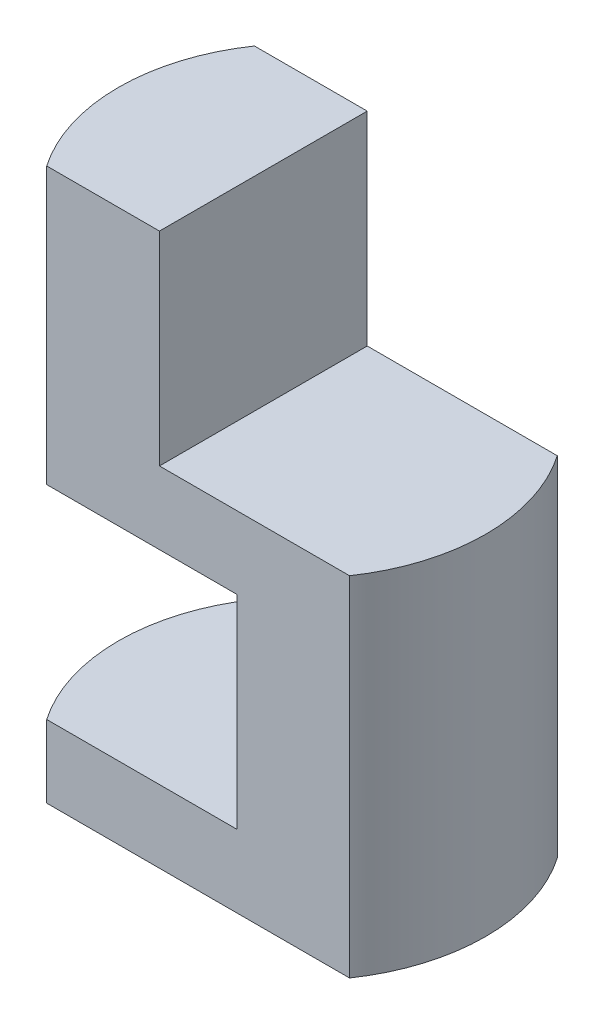
ISO-10303-21;
HEADER;
FILE_DESCRIPTION(('STEP AP214'),'2;1');
FILE_NAME('part.step','',(''),(''),'','','');
FILE_SCHEMA(('AUTOMOTIVE_DESIGN { 1 0 10303 214 1 1 1 1 }'));
ENDSEC;
DATA;
#1=APPLICATION_CONTEXT('core data for automotive mechanical design processes');
#2=APPLICATION_PROTOCOL_DEFINITION('international standard','automotive_design',2000,#1);
#3=PRODUCT_CONTEXT('',#1,'mechanical');
#4=PRODUCT('Part','Part','',(#3));
#5=PRODUCT_RELATED_PRODUCT_CATEGORY('part','',(#4));
#6=PRODUCT_DEFINITION_FORMATION('','',#4);
#7=PRODUCT_DEFINITION_CONTEXT('part definition',#1,'design');
#8=PRODUCT_DEFINITION('design','',#6,#7);
#9=PRODUCT_DEFINITION_SHAPE('','',#8);
#10=(LENGTH_UNIT() NAMED_UNIT(*) SI_UNIT(.MILLI.,.METRE.));
#11=(NAMED_UNIT(*) PLANE_ANGLE_UNIT() SI_UNIT($,.RADIAN.));
#12=(NAMED_UNIT(*) SI_UNIT($,.STERADIAN.) SOLID_ANGLE_UNIT());
#13=UNCERTAINTY_MEASURE_WITH_UNIT(LENGTH_MEASURE(1.E-05),#10,'distance_accuracy_value','');
#14=(GEOMETRIC_REPRESENTATION_CONTEXT(3) GLOBAL_UNCERTAINTY_ASSIGNED_CONTEXT((#13)) GLOBAL_UNIT_ASSIGNED_CONTEXT((#10,
#11,#12)) REPRESENTATION_CONTEXT('',''));
#15=CARTESIAN_POINT('',(0.,0.,0.));
#16=DIRECTION('',(0.,0.,1.));
#17=DIRECTION('',(1.,0.,0.));
#18=AXIS2_PLACEMENT_3D('',#15,#16,#17);
#19=CARTESIAN_POINT('',(0.,15.,0.));
#20=DIRECTION('',(0.,1.,0.));
#21=DIRECTION('',(0.,0.,1.));
#22=AXIS2_PLACEMENT_3D('',#19,#20,#21);
#23=PLANE('',#22);
#24=CARTESIAN_POINT('',(0.,15.,0.));
#25=DIRECTION('',(0.,1.,0.));
#26=DIRECTION('',(0.,0.,1.));
#27=AXIS2_PLACEMENT_3D('',#24,#25,#26);
#28=CIRCLE('',#27,38.);
#29=CARTESIAN_POINT('',(-31.3328900677866,15.,21.5));
#30=VERTEX_POINT('',#29);
#31=CARTESIAN_POINT('',(-31.3328900677866,15.,-21.5));
#32=VERTEX_POINT('',#31);
#33=EDGE_CURVE('E216',#30,#32,#28,.F.);
#34=ORIENTED_EDGE('',*,*,#33,.F.);
#35=DIRECTION('',(1.,0.,0.));
#36=VECTOR('',#35,1.);
#37=CARTESIAN_POINT('',(-38.,15.,21.5));
#38=LINE('',#37,#36);
#39=CARTESIAN_POINT('',(8.00000000000001,15.,21.5));
#40=VERTEX_POINT('',#39);
#41=EDGE_CURVE('E192',#30,#40,#38,.T.);
#42=ORIENTED_EDGE('',*,*,#41,.T.);
#43=DIRECTION('',(0.,0.,1.));
#44=VECTOR('',#43,1.);
#45=CARTESIAN_POINT('',(8.00000000000001,15.,21.5));
#46=LINE('',#45,#44);
#47=CARTESIAN_POINT('',(8.00000000000001,15.,-21.5));
#48=VERTEX_POINT('',#47);
#49=EDGE_CURVE('E177',#48,#40,#46,.T.);
#50=ORIENTED_EDGE('',*,*,#49,.F.);
#51=DIRECTION('',(1.,0.,0.));
#52=VECTOR('',#51,1.);
#53=CARTESIAN_POINT('',(-38.,15.,-21.5));
#54=LINE('',#53,#52);
#55=EDGE_CURVE('E65',#32,#48,#54,.T.);
#56=ORIENTED_EDGE('',*,*,#55,.F.);
#57=EDGE_LOOP('',(#34,#42,#50,#56));
#58=FACE_BOUND('',#57,.T.);
#59=ADVANCED_FACE('F57',(#58),#23,.T.);
#60=CARTESIAN_POINT('',(0.,0.,0.));
#61=DIRECTION('',(0.,1.,0.));
#62=DIRECTION('',(0.,0.,1.));
#63=AXIS2_PLACEMENT_3D('',#60,#61,#62);
#64=PLANE('',#63);
#65=DIRECTION('',(1.,0.,0.));
#66=VECTOR('',#65,1.);
#67=CARTESIAN_POINT('',(-38.,0.,21.5));
#68=LINE('',#67,#66);
#69=CARTESIAN_POINT('',(-31.3328900677866,0.,21.5));
#70=VERTEX_POINT('',#69);
#71=CARTESIAN_POINT('',(31.3328900677866,0.,21.5));
#72=VERTEX_POINT('',#71);
#73=EDGE_CURVE('E191',#70,#72,#68,.T.);
#74=ORIENTED_EDGE('',*,*,#73,.F.);
#75=CARTESIAN_POINT('',(0.,0.,0.));
#76=DIRECTION('',(0.,1.,0.));
#77=DIRECTION('',(0.,0.,1.));
#78=AXIS2_PLACEMENT_3D('',#75,#76,#77);
#79=CIRCLE('',#78,38.);
#80=CARTESIAN_POINT('',(-31.3328900677866,0.,-21.5));
#81=VERTEX_POINT('',#80);
#82=EDGE_CURVE('E72',#81,#70,#79,.T.);
#83=ORIENTED_EDGE('',*,*,#82,.F.);
#84=DIRECTION('',(1.,0.,0.));
#85=VECTOR('',#84,1.);
#86=CARTESIAN_POINT('',(-38.,0.,-21.5));
#87=LINE('',#86,#85);
#88=CARTESIAN_POINT('',(31.3328900677866,0.,-21.5));
#89=VERTEX_POINT('',#88);
#90=EDGE_CURVE('E194',#81,#89,#87,.T.);
#91=ORIENTED_EDGE('',*,*,#90,.T.);
#92=EDGE_CURVE('E200',#72,#89,#79,.T.);
#93=ORIENTED_EDGE('',*,*,#92,.F.);
#94=EDGE_LOOP('',(#74,#83,#91,#93));
#95=FACE_BOUND('',#94,.T.);
#96=ADVANCED_FACE('F199',(#95),#64,.F.);
#97=CARTESIAN_POINT('',(0.,57.1,0.));
#98=DIRECTION('',(0.,1.,0.));
#99=DIRECTION('',(0.,0.,1.));
#100=AXIS2_PLACEMENT_3D('',#97,#98,#99);
#101=PLANE('',#100);
#102=DIRECTION('',(1.,0.,0.));
#103=VECTOR('',#102,1.);
#104=CARTESIAN_POINT('',(0.,57.1,21.5));
#105=LINE('',#104,#103);
#106=CARTESIAN_POINT('',(-31.3328900677866,57.1,21.5));
#107=VERTEX_POINT('',#106);
#108=CARTESIAN_POINT('',(8.00000000000001,57.1,21.5));
#109=VERTEX_POINT('',#108);
#110=EDGE_CURVE('E172',#107,#109,#105,.T.);
#111=ORIENTED_EDGE('',*,*,#110,.F.);
#112=CARTESIAN_POINT('',(0.,57.1,0.));
#113=DIRECTION('',(0.,1.,0.));
#114=DIRECTION('',(0.,0.,1.));
#115=AXIS2_PLACEMENT_3D('',#112,#113,#114);
#116=CIRCLE('',#115,38.);
#117=CARTESIAN_POINT('',(-31.3328900677866,57.1,-21.5));
#118=VERTEX_POINT('',#117);
#119=EDGE_CURVE('E152',#107,#118,#116,.F.);
#120=ORIENTED_EDGE('',*,*,#119,.T.);
#121=DIRECTION('',(-1.,0.,0.));
#122=VECTOR('',#121,1.);
#123=CARTESIAN_POINT('',(0.,57.1,-21.5));
#124=LINE('',#123,#122);
#125=CARTESIAN_POINT('',(8.00000000000001,57.1,-21.5));
#126=VERTEX_POINT('',#125);
#127=EDGE_CURVE('E151',#126,#118,#124,.T.);
#128=ORIENTED_EDGE('',*,*,#127,.F.);
#129=DIRECTION('',(0.,0.,1.));
#130=VECTOR('',#129,1.);
#131=CARTESIAN_POINT('',(8.00000000000001,57.1,21.5));
#132=LINE('',#131,#130);
#133=EDGE_CURVE('E180',#126,#109,#132,.T.);
#134=ORIENTED_EDGE('',*,*,#133,.T.);
#135=EDGE_LOOP('',(#111,#120,#128,#134));
#136=FACE_BOUND('',#135,.T.);
#137=ADVANCED_FACE('F241',(#136),#101,.F.);
#138=CARTESIAN_POINT('',(0.,72.1,0.));
#139=DIRECTION('',(0.,1.,0.));
#140=DIRECTION('',(0.,0.,1.));
#141=AXIS2_PLACEMENT_3D('',#138,#139,#140);
#142=PLANE('',#141);
#143=CARTESIAN_POINT('',(0.,72.1,0.));
#144=DIRECTION('',(0.,1.,0.));
#145=DIRECTION('',(0.,0.,1.));
#146=AXIS2_PLACEMENT_3D('',#143,#144,#145);
#147=CIRCLE('',#146,38.);
#148=CARTESIAN_POINT('',(31.3328900677866,72.1,-21.5));
#149=VERTEX_POINT('',#148);
#150=CARTESIAN_POINT('',(31.3328900677866,72.1,21.5));
#151=VERTEX_POINT('',#150);
#152=EDGE_CURVE('E207',#149,#151,#147,.F.);
#153=ORIENTED_EDGE('',*,*,#152,.F.);
#154=DIRECTION('',(-1.,0.,0.));
#155=VECTOR('',#154,1.);
#156=CARTESIAN_POINT('',(0.,72.1,-21.5));
#157=LINE('',#156,#155);
#158=CARTESIAN_POINT('',(-7.99999999999999,72.1,-21.5));
#159=VERTEX_POINT('',#158);
#160=EDGE_CURVE('E175',#149,#159,#157,.T.);
#161=ORIENTED_EDGE('',*,*,#160,.T.);
#162=DIRECTION('',(0.,0.,-1.));
#163=VECTOR('',#162,1.);
#164=CARTESIAN_POINT('',(-7.99999999999999,72.1,-21.5));
#165=LINE('',#164,#163);
#166=CARTESIAN_POINT('',(-7.99999999999999,72.1,21.5));
#167=VERTEX_POINT('',#166);
#168=EDGE_CURVE('E80',#167,#159,#165,.T.);
#169=ORIENTED_EDGE('',*,*,#168,.F.);
#170=DIRECTION('',(1.,0.,0.));
#171=VECTOR('',#170,1.);
#172=CARTESIAN_POINT('',(0.,72.1,21.5));
#173=LINE('',#172,#171);
#174=EDGE_CURVE('E173',#167,#151,#173,.T.);
#175=ORIENTED_EDGE('',*,*,#174,.T.);
#176=EDGE_LOOP('',(#153,#161,#169,#175));
#177=FACE_BOUND('',#176,.T.);
#178=ADVANCED_FACE('F252',(#177),#142,.T.);
#179=CARTESIAN_POINT('',(0.,114.2,0.));
#180=DIRECTION('',(0.,1.,0.));
#181=DIRECTION('',(0.,0.,1.));
#182=AXIS2_PLACEMENT_3D('',#179,#180,#181);
#183=PLANE('',#182);
#184=CARTESIAN_POINT('',(0.,114.2,0.));
#185=DIRECTION('',(0.,1.,0.));
#186=DIRECTION('',(0.,0.,1.));
#187=AXIS2_PLACEMENT_3D('',#184,#185,#186);
#188=CIRCLE('',#187,38.);
#189=CARTESIAN_POINT('',(-31.3328900677866,114.2,21.5));
#190=VERTEX_POINT('',#189);
#191=CARTESIAN_POINT('',(-31.3328900677866,114.2,-21.5));
#192=VERTEX_POINT('',#191);
#193=EDGE_CURVE('E13',#190,#192,#188,.F.);
#194=ORIENTED_EDGE('',*,*,#193,.F.);
#195=DIRECTION('',(1.,0.,0.));
#196=VECTOR('',#195,1.);
#197=CARTESIAN_POINT('',(-38.,114.2,21.5));
#198=LINE('',#197,#196);
#199=CARTESIAN_POINT('',(-7.99999999999999,114.2,21.5));
#200=VERTEX_POINT('',#199);
#201=EDGE_CURVE('E164',#190,#200,#198,.T.);
#202=ORIENTED_EDGE('',*,*,#201,.T.);
#203=DIRECTION('',(0.,0.,-1.));
#204=VECTOR('',#203,1.);
#205=CARTESIAN_POINT('',(-7.99999999999999,114.2,-21.5));
#206=LINE('',#205,#204);
#207=CARTESIAN_POINT('',(-7.99999999999999,114.2,-21.5));
#208=VERTEX_POINT('',#207);
#209=EDGE_CURVE('E158',#200,#208,#206,.T.);
#210=ORIENTED_EDGE('',*,*,#209,.T.);
#211=DIRECTION('',(-1.,0.,0.));
#212=VECTOR('',#211,1.);
#213=CARTESIAN_POINT('',(-38.,114.2,-21.5));
#214=LINE('',#213,#212);
#215=EDGE_CURVE('E149',#208,#192,#214,.T.);
#216=ORIENTED_EDGE('',*,*,#215,.T.);
#217=EDGE_LOOP('',(#194,#202,#210,#216));
#218=FACE_BOUND('',#217,.T.);
#219=ADVANCED_FACE('F156',(#218),#183,.T.);
#220=CARTESIAN_POINT('',(-38.,15.,21.5));
#221=DIRECTION('',(0.,0.,-1.));
#222=DIRECTION('',(-1.,0.,0.));
#223=AXIS2_PLACEMENT_3D('',#220,#221,#222);
#224=PLANE('',#223);
#225=ORIENTED_EDGE('',*,*,#73,.T.);
#226=DIRECTION('',(0.,-1.,0.));
#227=VECTOR('',#226,1.);
#228=CARTESIAN_POINT('',(31.3328900677866,114.2,21.5));
#229=LINE('',#228,#227);
#230=EDGE_CURVE('E153',#72,#151,#229,.F.);
#231=ORIENTED_EDGE('',*,*,#230,.T.);
#232=ORIENTED_EDGE('',*,*,#174,.F.);
#233=DIRECTION('',(0.,-1.,0.));
#234=VECTOR('',#233,1.);
#235=CARTESIAN_POINT('',(-7.99999999999999,114.2,21.5));
#236=LINE('',#235,#234);
#237=EDGE_CURVE('E162',#200,#167,#236,.T.);
#238=ORIENTED_EDGE('',*,*,#237,.F.);
#239=ORIENTED_EDGE('',*,*,#201,.F.);
#240=DIRECTION('',(0.,-1.,0.));
#241=VECTOR('',#240,1.);
#242=CARTESIAN_POINT('',(-31.3328900677866,114.2,21.5));
#243=LINE('',#242,#241);
#244=EDGE_CURVE('E140',#190,#107,#243,.T.);
#245=ORIENTED_EDGE('',*,*,#244,.T.);
#246=ORIENTED_EDGE('',*,*,#110,.T.);
#247=DIRECTION('',(0.,-1.,0.));
#248=VECTOR('',#247,1.);
#249=CARTESIAN_POINT('',(8.00000000000001,57.1,21.5));
#250=LINE('',#249,#248);
#251=EDGE_CURVE('E183',#109,#40,#250,.T.);
#252=ORIENTED_EDGE('',*,*,#251,.T.);
#253=ORIENTED_EDGE('',*,*,#41,.F.);
#254=EDGE_CURVE('E168',#30,#70,#243,.T.);
#255=ORIENTED_EDGE('',*,*,#254,.T.);
#256=EDGE_LOOP('',(#225,#231,#232,#238,#239,#245,#246,#252,#253,#255));
#257=FACE_BOUND('',#256,.T.);
#258=ADVANCED_FACE('F59',(#257),#224,.F.);
#259=CARTESIAN_POINT('',(-38.,15.,-21.5));
#260=DIRECTION('',(0.,0.,-1.));
#261=DIRECTION('',(-1.,0.,0.));
#262=AXIS2_PLACEMENT_3D('',#259,#260,#261);
#263=PLANE('',#262);
#264=DIRECTION('',(0.,-1.,0.));
#265=VECTOR('',#264,1.);
#266=CARTESIAN_POINT('',(31.3328900677866,114.2,-21.5));
#267=LINE('',#266,#265);
#268=EDGE_CURVE('E204',#89,#149,#267,.F.);
#269=ORIENTED_EDGE('',*,*,#268,.F.);
#270=ORIENTED_EDGE('',*,*,#90,.F.);
#271=DIRECTION('',(0.,-1.,0.));
#272=VECTOR('',#271,1.);
#273=CARTESIAN_POINT('',(-31.3328900677866,114.2,-21.5));
#274=LINE('',#273,#272);
#275=EDGE_CURVE('E155',#32,#81,#274,.T.);
#276=ORIENTED_EDGE('',*,*,#275,.F.);
#277=ORIENTED_EDGE('',*,*,#55,.T.);
#278=DIRECTION('',(0.,-1.,0.));
#279=VECTOR('',#278,1.);
#280=CARTESIAN_POINT('',(8.00000000000001,57.1,-21.5));
#281=LINE('',#280,#279);
#282=EDGE_CURVE('E188',#126,#48,#281,.T.);
#283=ORIENTED_EDGE('',*,*,#282,.F.);
#284=ORIENTED_EDGE('',*,*,#127,.T.);
#285=EDGE_CURVE('E137',#192,#118,#274,.T.);
#286=ORIENTED_EDGE('',*,*,#285,.F.);
#287=ORIENTED_EDGE('',*,*,#215,.F.);
#288=DIRECTION('',(0.,-1.,0.));
#289=VECTOR('',#288,1.);
#290=CARTESIAN_POINT('',(-7.99999999999999,114.2,-21.5));
#291=LINE('',#290,#289);
#292=EDGE_CURVE('E160',#208,#159,#291,.T.);
#293=ORIENTED_EDGE('',*,*,#292,.T.);
#294=ORIENTED_EDGE('',*,*,#160,.F.);
#295=EDGE_LOOP('',(#269,#270,#276,#277,#283,#284,#286,#287,#293,#294));
#296=FACE_BOUND('',#295,.T.);
#297=ADVANCED_FACE('F147',(#296),#263,.T.);
#298=CARTESIAN_POINT('',(8.00000000000001,57.1,21.5));
#299=DIRECTION('',(1.,0.,0.));
#300=DIRECTION('',(0.,0.,-1.));
#301=AXIS2_PLACEMENT_3D('',#298,#299,#300);
#302=PLANE('',#301);
#303=ORIENTED_EDGE('',*,*,#49,.T.);
#304=ORIENTED_EDGE('',*,*,#251,.F.);
#305=ORIENTED_EDGE('',*,*,#133,.F.);
#306=ORIENTED_EDGE('',*,*,#282,.T.);
#307=EDGE_LOOP('',(#303,#304,#305,#306));
#308=FACE_BOUND('',#307,.T.);
#309=ADVANCED_FACE('F222',(#308),#302,.F.);
#310=CARTESIAN_POINT('',(-7.99999999999999,114.2,-21.5));
#311=DIRECTION('',(-1.,0.,0.));
#312=DIRECTION('',(0.,0.,1.));
#313=AXIS2_PLACEMENT_3D('',#310,#311,#312);
#314=PLANE('',#313);
#315=ORIENTED_EDGE('',*,*,#168,.T.);
#316=ORIENTED_EDGE('',*,*,#292,.F.);
#317=ORIENTED_EDGE('',*,*,#209,.F.);
#318=ORIENTED_EDGE('',*,*,#237,.T.);
#319=EDGE_LOOP('',(#315,#316,#317,#318));
#320=FACE_BOUND('',#319,.T.);
#321=ADVANCED_FACE('F220',(#320),#314,.F.);
#322=CARTESIAN_POINT('',(0.,114.2,0.));
#323=DIRECTION('',(0.,-1.,0.));
#324=DIRECTION('',(0.,0.,-1.));
#325=AXIS2_PLACEMENT_3D('',#322,#323,#324);
#326=CYLINDRICAL_SURFACE('',#325,38.);
#327=ORIENTED_EDGE('',*,*,#193,.T.);
#328=ORIENTED_EDGE('',*,*,#285,.T.);
#329=ORIENTED_EDGE('',*,*,#119,.F.);
#330=ORIENTED_EDGE('',*,*,#244,.F.);
#331=EDGE_LOOP('',(#327,#328,#329,#330));
#332=FACE_BOUND('',#331,.T.);
#333=ADVANCED_FACE('F136',(#332),#326,.T.);
#334=ORIENTED_EDGE('',*,*,#92,.T.);
#335=ORIENTED_EDGE('',*,*,#268,.T.);
#336=ORIENTED_EDGE('',*,*,#152,.T.);
#337=ORIENTED_EDGE('',*,*,#230,.F.);
#338=EDGE_LOOP('',(#334,#335,#336,#337));
#339=FACE_BOUND('',#338,.T.);
#340=ADVANCED_FACE('F229',(#339),#326,.T.);
#341=ORIENTED_EDGE('',*,*,#82,.T.);
#342=ORIENTED_EDGE('',*,*,#254,.F.);
#343=ORIENTED_EDGE('',*,*,#33,.T.);
#344=ORIENTED_EDGE('',*,*,#275,.T.);
#345=EDGE_LOOP('',(#341,#342,#343,#344));
#346=FACE_BOUND('',#345,.T.);
#347=ADVANCED_FACE('F231',(#346),#326,.T.);
#348=CLOSED_SHELL('',(#59,#96,#137,#178,#219,#258,#297,#309,#321,#333,#340,#347));
#349=MANIFOLD_SOLID_BREP('B2',#348);
#350=ADVANCED_BREP_SHAPE_REPRESENTATION('',(#18,#349),#14);
#351=SHAPE_DEFINITION_REPRESENTATION(#9,#350);
ENDSEC;
END-ISO-10303-21;
